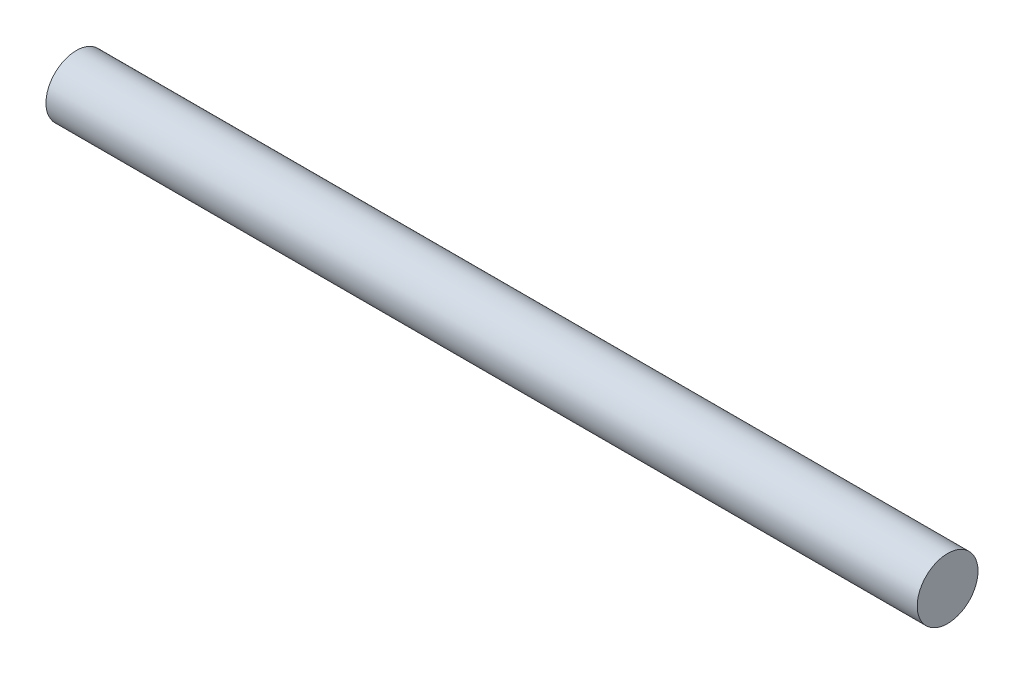
ISO-10303-21;
HEADER;
FILE_DESCRIPTION(('STEP AP214'),'2;1');
FILE_NAME('part.step','',(''),(''),'','','');
FILE_SCHEMA(('AUTOMOTIVE_DESIGN { 1 0 10303 214 1 1 1 1 }'));
ENDSEC;
DATA;
#1=APPLICATION_CONTEXT('core data for automotive mechanical design processes');
#2=APPLICATION_PROTOCOL_DEFINITION('international standard','automotive_design',2000,#1);
#3=PRODUCT_CONTEXT('',#1,'mechanical');
#4=PRODUCT('Part','Part','',(#3));
#5=PRODUCT_RELATED_PRODUCT_CATEGORY('part','',(#4));
#6=PRODUCT_DEFINITION_FORMATION('','',#4);
#7=PRODUCT_DEFINITION_CONTEXT('part definition',#1,'design');
#8=PRODUCT_DEFINITION('design','',#6,#7);
#9=PRODUCT_DEFINITION_SHAPE('','',#8);
#10=(LENGTH_UNIT() NAMED_UNIT(*) SI_UNIT(.MILLI.,.METRE.));
#11=(NAMED_UNIT(*) PLANE_ANGLE_UNIT() SI_UNIT($,.RADIAN.));
#12=(NAMED_UNIT(*) SI_UNIT($,.STERADIAN.) SOLID_ANGLE_UNIT());
#13=UNCERTAINTY_MEASURE_WITH_UNIT(LENGTH_MEASURE(1.E-05),#10,'distance_accuracy_value','');
#14=(GEOMETRIC_REPRESENTATION_CONTEXT(3) GLOBAL_UNCERTAINTY_ASSIGNED_CONTEXT((#13)) GLOBAL_UNIT_ASSIGNED_CONTEXT((#10,
#11,#12)) REPRESENTATION_CONTEXT('',''));
#15=CARTESIAN_POINT('',(0.,0.,0.));
#16=DIRECTION('',(0.,0.,1.));
#17=DIRECTION('',(1.,0.,0.));
#18=AXIS2_PLACEMENT_3D('',#15,#16,#17);
#19=CARTESIAN_POINT('',(430.,0.,0.));
#20=DIRECTION('',(-1.,0.,0.));
#21=DIRECTION('',(0.,0.,1.));
#22=AXIS2_PLACEMENT_3D('',#19,#20,#21);
#23=CYLINDRICAL_SURFACE('',#22,15.);
#24=CARTESIAN_POINT('',(430.,0.,0.));
#25=DIRECTION('',(1.,0.,0.));
#26=DIRECTION('',(0.,0.,-1.));
#27=AXIS2_PLACEMENT_3D('',#24,#25,#26);
#28=CIRCLE('',#27,15.);
#29=CARTESIAN_POINT('',(430.,0.,-15.));
#30=VERTEX_POINT('',#29);
#31=EDGE_CURVE('E10',#30,#30,#28,.T.);
#32=ORIENTED_EDGE('',*,*,#31,.F.);
#33=EDGE_LOOP('',(#32));
#34=FACE_BOUND('',#33,.T.);
#35=CARTESIAN_POINT('',(0.,0.,0.));
#36=DIRECTION('',(1.,0.,0.));
#37=DIRECTION('',(0.,0.,-1.));
#38=AXIS2_PLACEMENT_3D('',#35,#36,#37);
#39=CIRCLE('',#38,15.);
#40=CARTESIAN_POINT('',(0.,0.,-15.));
#41=VERTEX_POINT('',#40);
#42=EDGE_CURVE('E34',#41,#41,#39,.T.);
#43=ORIENTED_EDGE('',*,*,#42,.T.);
#44=EDGE_LOOP('',(#43));
#45=FACE_BOUND('',#44,.T.);
#46=ADVANCED_FACE('F31',(#34,#45),#23,.T.);
#47=CARTESIAN_POINT('',(430.,0.,0.));
#48=DIRECTION('',(1.,0.,0.));
#49=DIRECTION('',(0.,0.,-1.));
#50=AXIS2_PLACEMENT_3D('',#47,#48,#49);
#51=PLANE('',#50);
#52=ORIENTED_EDGE('',*,*,#31,.T.);
#53=EDGE_LOOP('',(#52));
#54=FACE_BOUND('',#53,.T.);
#55=ADVANCED_FACE('F46',(#54),#51,.T.);
#56=CARTESIAN_POINT('',(0.,0.,0.));
#57=DIRECTION('',(1.,0.,0.));
#58=DIRECTION('',(0.,0.,-1.));
#59=AXIS2_PLACEMENT_3D('',#56,#57,#58);
#60=PLANE('',#59);
#61=ORIENTED_EDGE('',*,*,#42,.F.);
#62=EDGE_LOOP('',(#61));
#63=FACE_BOUND('',#62,.T.);
#64=ADVANCED_FACE('F44',(#63),#60,.F.);
#65=CLOSED_SHELL('',(#46,#55,#64));
#66=MANIFOLD_SOLID_BREP('B2',#65);
#67=ADVANCED_BREP_SHAPE_REPRESENTATION('',(#18,#66),#14);
#68=SHAPE_DEFINITION_REPRESENTATION(#9,#67);
ENDSEC;
END-ISO-10303-21;
